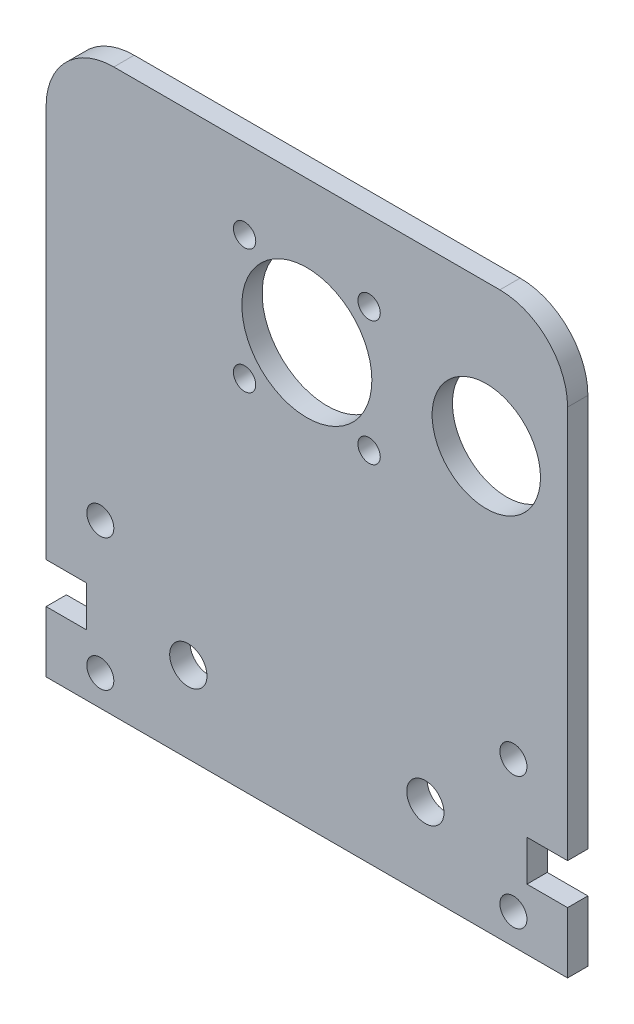
ISO-10303-21;
HEADER;
FILE_DESCRIPTION(('STEP AP214'),'2;1');
FILE_NAME('part.step','',(''),(''),'','','');
FILE_SCHEMA(('AUTOMOTIVE_DESIGN { 1 0 10303 214 1 1 1 1 }'));
ENDSEC;
DATA;
#1=APPLICATION_CONTEXT('core data for automotive mechanical design processes');
#2=APPLICATION_PROTOCOL_DEFINITION('international standard','automotive_design',2000,#1);
#3=PRODUCT_CONTEXT('',#1,'mechanical');
#4=PRODUCT('Part','Part','',(#3));
#5=PRODUCT_RELATED_PRODUCT_CATEGORY('part','',(#4));
#6=PRODUCT_DEFINITION_FORMATION('','',#4);
#7=PRODUCT_DEFINITION_CONTEXT('part definition',#1,'design');
#8=PRODUCT_DEFINITION('design','',#6,#7);
#9=PRODUCT_DEFINITION_SHAPE('','',#8);
#10=(LENGTH_UNIT() NAMED_UNIT(*) SI_UNIT(.MILLI.,.METRE.));
#11=(NAMED_UNIT(*) PLANE_ANGLE_UNIT() SI_UNIT($,.RADIAN.));
#12=(NAMED_UNIT(*) SI_UNIT($,.STERADIAN.) SOLID_ANGLE_UNIT());
#13=UNCERTAINTY_MEASURE_WITH_UNIT(LENGTH_MEASURE(1.E-05),#10,'distance_accuracy_value','');
#14=(GEOMETRIC_REPRESENTATION_CONTEXT(3) GLOBAL_UNCERTAINTY_ASSIGNED_CONTEXT((#13)) GLOBAL_UNIT_ASSIGNED_CONTEXT((#10,
#11,#12)) REPRESENTATION_CONTEXT('',''));
#15=CARTESIAN_POINT('',(0.,0.,0.));
#16=DIRECTION('',(0.,0.,1.));
#17=DIRECTION('',(1.,0.,0.));
#18=AXIS2_PLACEMENT_3D('',#15,#16,#17);
#19=CARTESIAN_POINT('',(77.,0.,3.));
#20=DIRECTION('',(-1.,0.,0.));
#21=DIRECTION('',(0.,0.,1.));
#22=AXIS2_PLACEMENT_3D('',#19,#20,#21);
#23=PLANE('',#22);
#24=DIRECTION('',(0.,1.,0.));
#25=VECTOR('',#24,1.);
#26=CARTESIAN_POINT('',(77.,0.,0.));
#27=LINE('',#26,#25);
#28=CARTESIAN_POINT('',(77.,-6.,0.));
#29=VERTEX_POINT('',#28);
#30=CARTESIAN_POINT('',(77.,3.00000000000001,0.));
#31=VERTEX_POINT('',#30);
#32=EDGE_CURVE('E196',#29,#31,#27,.T.);
#33=ORIENTED_EDGE('',*,*,#32,.T.);
#34=DIRECTION('',(0.,0.,-1.));
#35=VECTOR('',#34,1.);
#36=CARTESIAN_POINT('',(77.,3.00000000000001,3.));
#37=LINE('',#36,#35);
#38=CARTESIAN_POINT('',(77.,3.00000000000001,3.));
#39=VERTEX_POINT('',#38);
#40=EDGE_CURVE('E303',#39,#31,#37,.T.);
#41=ORIENTED_EDGE('',*,*,#40,.F.);
#42=DIRECTION('',(0.,1.,0.));
#43=VECTOR('',#42,1.);
#44=CARTESIAN_POINT('',(77.,0.,3.));
#45=LINE('',#44,#43);
#46=CARTESIAN_POINT('',(77.,-6.,3.));
#47=VERTEX_POINT('',#46);
#48=EDGE_CURVE('E181',#47,#39,#45,.T.);
#49=ORIENTED_EDGE('',*,*,#48,.F.);
#50=DIRECTION('',(0.,0.,1.));
#51=VECTOR('',#50,1.);
#52=CARTESIAN_POINT('',(77.,-6.,0.));
#53=LINE('',#52,#51);
#54=EDGE_CURVE('E191',#29,#47,#53,.T.);
#55=ORIENTED_EDGE('',*,*,#54,.F.);
#56=EDGE_LOOP('',(#33,#41,#49,#55));
#57=FACE_BOUND('',#56,.T.);
#58=ADVANCED_FACE('F65',(#57),#23,.F.);
#59=CARTESIAN_POINT('',(0.,2.99999999999999,3.));
#60=DIRECTION('',(0.,-1.,0.));
#61=DIRECTION('',(1.,0.,0.));
#62=AXIS2_PLACEMENT_3D('',#59,#60,#61);
#63=PLANE('',#62);
#64=DIRECTION('',(-1.,0.,0.));
#65=VECTOR('',#64,1.);
#66=CARTESIAN_POINT('',(0.,2.99999999999999,0.));
#67=LINE('',#66,#65);
#68=CARTESIAN_POINT('',(71.,3.00000000000001,0.));
#69=VERTEX_POINT('',#68);
#70=EDGE_CURVE('E266',#31,#69,#67,.T.);
#71=ORIENTED_EDGE('',*,*,#70,.T.);
#72=DIRECTION('',(0.,0.,-1.));
#73=VECTOR('',#72,1.);
#74=CARTESIAN_POINT('',(71.,3.00000000000001,3.));
#75=LINE('',#74,#73);
#76=CARTESIAN_POINT('',(71.,3.00000000000001,3.));
#77=VERTEX_POINT('',#76);
#78=EDGE_CURVE('E301',#77,#69,#75,.T.);
#79=ORIENTED_EDGE('',*,*,#78,.F.);
#80=DIRECTION('',(-1.,0.,0.));
#81=VECTOR('',#80,1.);
#82=CARTESIAN_POINT('',(0.,2.99999999999999,3.));
#83=LINE('',#82,#81);
#84=EDGE_CURVE('E217',#39,#77,#83,.T.);
#85=ORIENTED_EDGE('',*,*,#84,.F.);
#86=ORIENTED_EDGE('',*,*,#40,.T.);
#87=EDGE_LOOP('',(#71,#79,#85,#86));
#88=FACE_BOUND('',#87,.T.);
#89=ADVANCED_FACE('F354',(#88),#63,.F.);
#90=CARTESIAN_POINT('',(71.,0.,3.));
#91=DIRECTION('',(1.,0.,0.));
#92=DIRECTION('',(0.,0.,-1.));
#93=AXIS2_PLACEMENT_3D('',#90,#91,#92);
#94=PLANE('',#93);
#95=DIRECTION('',(0.,-1.,0.));
#96=VECTOR('',#95,1.);
#97=CARTESIAN_POINT('',(71.,0.,0.));
#98=LINE('',#97,#96);
#99=CARTESIAN_POINT('',(71.,9.00000000000001,0.));
#100=VERTEX_POINT('',#99);
#101=EDGE_CURVE('E270',#100,#69,#98,.T.);
#102=ORIENTED_EDGE('',*,*,#101,.F.);
#103=DIRECTION('',(0.,0.,-1.));
#104=VECTOR('',#103,1.);
#105=CARTESIAN_POINT('',(71.,9.00000000000001,3.));
#106=LINE('',#105,#104);
#107=CARTESIAN_POINT('',(71.,9.00000000000001,3.));
#108=VERTEX_POINT('',#107);
#109=EDGE_CURVE('E299',#108,#100,#106,.T.);
#110=ORIENTED_EDGE('',*,*,#109,.F.);
#111=DIRECTION('',(0.,-1.,0.));
#112=VECTOR('',#111,1.);
#113=CARTESIAN_POINT('',(71.,0.,3.));
#114=LINE('',#113,#112);
#115=EDGE_CURVE('E223',#108,#77,#114,.T.);
#116=ORIENTED_EDGE('',*,*,#115,.T.);
#117=ORIENTED_EDGE('',*,*,#78,.T.);
#118=EDGE_LOOP('',(#102,#110,#116,#117));
#119=FACE_BOUND('',#118,.T.);
#120=ADVANCED_FACE('F360',(#119),#94,.T.);
#121=CARTESIAN_POINT('',(0.,9.00000000000001,3.));
#122=DIRECTION('',(0.,-1.,0.));
#123=DIRECTION('',(0.,0.,-1.));
#124=AXIS2_PLACEMENT_3D('',#121,#122,#123);
#125=PLANE('',#124);
#126=DIRECTION('',(-1.,0.,0.));
#127=VECTOR('',#126,1.);
#128=CARTESIAN_POINT('',(0.,9.00000000000001,0.));
#129=LINE('',#128,#127);
#130=CARTESIAN_POINT('',(77.,9.00000000000001,0.));
#131=VERTEX_POINT('',#130);
#132=EDGE_CURVE('E273',#131,#100,#129,.T.);
#133=ORIENTED_EDGE('',*,*,#132,.F.);
#134=DIRECTION('',(0.,0.,-1.));
#135=VECTOR('',#134,1.);
#136=CARTESIAN_POINT('',(77.,9.00000000000001,3.));
#137=LINE('',#136,#135);
#138=CARTESIAN_POINT('',(77.,9.00000000000001,3.));
#139=VERTEX_POINT('',#138);
#140=EDGE_CURVE('E297',#139,#131,#137,.T.);
#141=ORIENTED_EDGE('',*,*,#140,.F.);
#142=DIRECTION('',(-1.,0.,0.));
#143=VECTOR('',#142,1.);
#144=CARTESIAN_POINT('',(0.,9.00000000000001,3.));
#145=LINE('',#144,#143);
#146=EDGE_CURVE('E226',#139,#108,#145,.T.);
#147=ORIENTED_EDGE('',*,*,#146,.T.);
#148=ORIENTED_EDGE('',*,*,#109,.T.);
#149=EDGE_LOOP('',(#133,#141,#147,#148));
#150=FACE_BOUND('',#149,.T.);
#151=ADVANCED_FACE('F499',(#150),#125,.T.);
#152=CARTESIAN_POINT('',(77.,0.,3.));
#153=DIRECTION('',(-1.,0.,0.));
#154=DIRECTION('',(0.,-1.,0.));
#155=AXIS2_PLACEMENT_3D('',#152,#153,#154);
#156=PLANE('',#155);
#157=DIRECTION('',(0.,1.,0.));
#158=VECTOR('',#157,1.);
#159=CARTESIAN_POINT('',(77.,0.,0.));
#160=LINE('',#159,#158);
#161=CARTESIAN_POINT('',(77.,67.,0.));
#162=VERTEX_POINT('',#161);
#163=EDGE_CURVE('E276',#131,#162,#160,.T.);
#164=ORIENTED_EDGE('',*,*,#163,.T.);
#165=DIRECTION('',(0.,0.,-1.));
#166=VECTOR('',#165,1.);
#167=CARTESIAN_POINT('',(77.,67.,3.));
#168=LINE('',#167,#166);
#169=CARTESIAN_POINT('',(77.,67.,3.));
#170=VERTEX_POINT('',#169);
#171=EDGE_CURVE('E88',#162,#170,#168,.F.);
#172=ORIENTED_EDGE('',*,*,#171,.T.);
#173=DIRECTION('',(0.,1.,0.));
#174=VECTOR('',#173,1.);
#175=CARTESIAN_POINT('',(77.,0.,3.));
#176=LINE('',#175,#174);
#177=EDGE_CURVE('E230',#139,#170,#176,.T.);
#178=ORIENTED_EDGE('',*,*,#177,.F.);
#179=ORIENTED_EDGE('',*,*,#140,.T.);
#180=EDGE_LOOP('',(#164,#172,#178,#179));
#181=FACE_BOUND('',#180,.T.);
#182=ADVANCED_FACE('F318',(#181),#156,.F.);
#183=CARTESIAN_POINT('',(0.,77.,3.));
#184=DIRECTION('',(0.,1.,0.));
#185=DIRECTION('',(-1.,0.,0.));
#186=AXIS2_PLACEMENT_3D('',#183,#184,#185);
#187=PLANE('',#186);
#188=DIRECTION('',(1.,0.,0.));
#189=VECTOR('',#188,1.);
#190=CARTESIAN_POINT('',(0.,77.,3.));
#191=LINE('',#190,#189);
#192=CARTESIAN_POINT('',(10.,77.,3.));
#193=VERTEX_POINT('',#192);
#194=CARTESIAN_POINT('',(67.,77.,3.));
#195=VERTEX_POINT('',#194);
#196=EDGE_CURVE('E233',#193,#195,#191,.T.);
#197=ORIENTED_EDGE('',*,*,#196,.T.);
#198=DIRECTION('',(0.,0.,-1.));
#199=VECTOR('',#198,1.);
#200=CARTESIAN_POINT('',(67.,77.,0.));
#201=LINE('',#200,#199);
#202=CARTESIAN_POINT('',(67.,77.,0.));
#203=VERTEX_POINT('',#202);
#204=EDGE_CURVE('E308',#195,#203,#201,.T.);
#205=ORIENTED_EDGE('',*,*,#204,.T.);
#206=DIRECTION('',(1.,0.,0.));
#207=VECTOR('',#206,1.);
#208=CARTESIAN_POINT('',(0.,77.,0.));
#209=LINE('',#208,#207);
#210=CARTESIAN_POINT('',(10.,77.,0.));
#211=VERTEX_POINT('',#210);
#212=EDGE_CURVE('E278',#211,#203,#209,.T.);
#213=ORIENTED_EDGE('',*,*,#212,.F.);
#214=DIRECTION('',(0.,0.,-1.));
#215=VECTOR('',#214,1.);
#216=CARTESIAN_POINT('',(10.,77.,3.));
#217=LINE('',#216,#215);
#218=EDGE_CURVE('E306',#211,#193,#217,.F.);
#219=ORIENTED_EDGE('',*,*,#218,.T.);
#220=EDGE_LOOP('',(#197,#205,#213,#219));
#221=FACE_BOUND('',#220,.T.);
#222=ADVANCED_FACE('F325',(#221),#187,.T.);
#223=CARTESIAN_POINT('',(0.,0.,3.));
#224=DIRECTION('',(-1.,0.,0.));
#225=DIRECTION('',(0.,0.,1.));
#226=AXIS2_PLACEMENT_3D('',#223,#224,#225);
#227=PLANE('',#226);
#228=DIRECTION('',(0.,1.,0.));
#229=VECTOR('',#228,1.);
#230=CARTESIAN_POINT('',(0.,0.,3.));
#231=LINE('',#230,#229);
#232=CARTESIAN_POINT('',(0.,9.,3.));
#233=VERTEX_POINT('',#232);
#234=CARTESIAN_POINT('',(0.,67.,3.));
#235=VERTEX_POINT('',#234);
#236=EDGE_CURVE('E251',#233,#235,#231,.T.);
#237=ORIENTED_EDGE('',*,*,#236,.T.);
#238=DIRECTION('',(0.,0.,-1.));
#239=VECTOR('',#238,1.);
#240=CARTESIAN_POINT('',(0.,67.,3.));
#241=LINE('',#240,#239);
#242=CARTESIAN_POINT('',(0.,67.,0.));
#243=VERTEX_POINT('',#242);
#244=EDGE_CURVE('E13',#235,#243,#241,.T.);
#245=ORIENTED_EDGE('',*,*,#244,.T.);
#246=DIRECTION('',(0.,1.,0.));
#247=VECTOR('',#246,1.);
#248=CARTESIAN_POINT('',(0.,0.,0.));
#249=LINE('',#248,#247);
#250=CARTESIAN_POINT('',(0.,9.,0.));
#251=VERTEX_POINT('',#250);
#252=EDGE_CURVE('E280',#251,#243,#249,.T.);
#253=ORIENTED_EDGE('',*,*,#252,.F.);
#254=DIRECTION('',(0.,0.,-1.));
#255=VECTOR('',#254,1.);
#256=CARTESIAN_POINT('',(0.,9.,3.));
#257=LINE('',#256,#255);
#258=EDGE_CURVE('E295',#233,#251,#257,.T.);
#259=ORIENTED_EDGE('',*,*,#258,.F.);
#260=EDGE_LOOP('',(#237,#245,#253,#259));
#261=FACE_BOUND('',#260,.T.);
#262=ADVANCED_FACE('F331',(#261),#227,.T.);
#263=CARTESIAN_POINT('',(0.,9.,3.));
#264=DIRECTION('',(0.,1.,0.));
#265=DIRECTION('',(0.,0.,1.));
#266=AXIS2_PLACEMENT_3D('',#263,#264,#265);
#267=PLANE('',#266);
#268=DIRECTION('',(1.,0.,0.));
#269=VECTOR('',#268,1.);
#270=CARTESIAN_POINT('',(0.,9.,0.));
#271=LINE('',#270,#269);
#272=CARTESIAN_POINT('',(6.,9.,0.));
#273=VERTEX_POINT('',#272);
#274=EDGE_CURVE('E283',#251,#273,#271,.T.);
#275=ORIENTED_EDGE('',*,*,#274,.T.);
#276=DIRECTION('',(0.,0.,-1.));
#277=VECTOR('',#276,1.);
#278=CARTESIAN_POINT('',(6.,9.,3.));
#279=LINE('',#278,#277);
#280=CARTESIAN_POINT('',(6.,9.,3.));
#281=VERTEX_POINT('',#280);
#282=EDGE_CURVE('E292',#281,#273,#279,.T.);
#283=ORIENTED_EDGE('',*,*,#282,.F.);
#284=DIRECTION('',(1.,0.,0.));
#285=VECTOR('',#284,1.);
#286=CARTESIAN_POINT('',(0.,9.,3.));
#287=LINE('',#286,#285);
#288=EDGE_CURVE('E253',#233,#281,#287,.T.);
#289=ORIENTED_EDGE('',*,*,#288,.F.);
#290=ORIENTED_EDGE('',*,*,#258,.T.);
#291=EDGE_LOOP('',(#275,#283,#289,#290));
#292=FACE_BOUND('',#291,.T.);
#293=ADVANCED_FACE('F336',(#292),#267,.F.);
#294=CARTESIAN_POINT('',(6.,0.,3.));
#295=DIRECTION('',(1.,0.,0.));
#296=DIRECTION('',(0.,1.,0.));
#297=AXIS2_PLACEMENT_3D('',#294,#295,#296);
#298=PLANE('',#297);
#299=DIRECTION('',(0.,-1.,0.));
#300=VECTOR('',#299,1.);
#301=CARTESIAN_POINT('',(6.,0.,0.));
#302=LINE('',#301,#300);
#303=CARTESIAN_POINT('',(6.,3.,0.));
#304=VERTEX_POINT('',#303);
#305=EDGE_CURVE('E285',#273,#304,#302,.T.);
#306=ORIENTED_EDGE('',*,*,#305,.T.);
#307=DIRECTION('',(0.,0.,-1.));
#308=VECTOR('',#307,1.);
#309=CARTESIAN_POINT('',(6.,3.,3.));
#310=LINE('',#309,#308);
#311=CARTESIAN_POINT('',(6.,3.,3.));
#312=VERTEX_POINT('',#311);
#313=EDGE_CURVE('E290',#312,#304,#310,.T.);
#314=ORIENTED_EDGE('',*,*,#313,.F.);
#315=DIRECTION('',(0.,-1.,0.));
#316=VECTOR('',#315,1.);
#317=CARTESIAN_POINT('',(6.,0.,3.));
#318=LINE('',#317,#316);
#319=EDGE_CURVE('E256',#281,#312,#318,.T.);
#320=ORIENTED_EDGE('',*,*,#319,.F.);
#321=ORIENTED_EDGE('',*,*,#282,.T.);
#322=EDGE_LOOP('',(#306,#314,#320,#321));
#323=FACE_BOUND('',#322,.T.);
#324=ADVANCED_FACE('F340',(#323),#298,.F.);
#325=CARTESIAN_POINT('',(0.,3.,3.));
#326=DIRECTION('',(0.,1.,0.));
#327=DIRECTION('',(0.,0.,1.));
#328=AXIS2_PLACEMENT_3D('',#325,#326,#327);
#329=PLANE('',#328);
#330=DIRECTION('',(1.,0.,0.));
#331=VECTOR('',#330,1.);
#332=CARTESIAN_POINT('',(0.,3.,0.));
#333=LINE('',#332,#331);
#334=CARTESIAN_POINT('',(0.,3.,0.));
#335=VERTEX_POINT('',#334);
#336=EDGE_CURVE('E182',#335,#304,#333,.T.);
#337=ORIENTED_EDGE('',*,*,#336,.F.);
#338=DIRECTION('',(0.,0.,-1.));
#339=VECTOR('',#338,1.);
#340=CARTESIAN_POINT('',(0.,3.,3.));
#341=LINE('',#340,#339);
#342=CARTESIAN_POINT('',(0.,3.,3.));
#343=VERTEX_POINT('',#342);
#344=EDGE_CURVE('E176',#343,#335,#341,.T.);
#345=ORIENTED_EDGE('',*,*,#344,.F.);
#346=DIRECTION('',(1.,0.,0.));
#347=VECTOR('',#346,1.);
#348=CARTESIAN_POINT('',(0.,3.,3.));
#349=LINE('',#348,#347);
#350=EDGE_CURVE('E259',#343,#312,#349,.T.);
#351=ORIENTED_EDGE('',*,*,#350,.T.);
#352=ORIENTED_EDGE('',*,*,#313,.T.);
#353=EDGE_LOOP('',(#337,#345,#351,#352));
#354=FACE_BOUND('',#353,.T.);
#355=ADVANCED_FACE('F344',(#354),#329,.T.);
#356=CARTESIAN_POINT('',(0.,0.,3.));
#357=DIRECTION('',(-1.,0.,0.));
#358=DIRECTION('',(0.,0.,1.));
#359=AXIS2_PLACEMENT_3D('',#356,#357,#358);
#360=PLANE('',#359);
#361=DIRECTION('',(0.,1.,0.));
#362=VECTOR('',#361,1.);
#363=CARTESIAN_POINT('',(0.,0.,0.));
#364=LINE('',#363,#362);
#365=CARTESIAN_POINT('',(0.,-6.,0.));
#366=VERTEX_POINT('',#365);
#367=EDGE_CURVE('E170',#366,#335,#364,.T.);
#368=ORIENTED_EDGE('',*,*,#367,.F.);
#369=DIRECTION('',(0.,0.,1.));
#370=VECTOR('',#369,1.);
#371=CARTESIAN_POINT('',(0.,-6.,0.));
#372=LINE('',#371,#370);
#373=CARTESIAN_POINT('',(0.,-6.,3.));
#374=VERTEX_POINT('',#373);
#375=EDGE_CURVE('E174',#366,#374,#372,.T.);
#376=ORIENTED_EDGE('',*,*,#375,.T.);
#377=DIRECTION('',(0.,1.,0.));
#378=VECTOR('',#377,1.);
#379=CARTESIAN_POINT('',(0.,0.,3.));
#380=LINE('',#379,#378);
#381=EDGE_CURVE('E262',#374,#343,#380,.T.);
#382=ORIENTED_EDGE('',*,*,#381,.T.);
#383=ORIENTED_EDGE('',*,*,#344,.T.);
#384=EDGE_LOOP('',(#368,#376,#382,#383));
#385=FACE_BOUND('',#384,.T.);
#386=ADVANCED_FACE('F172',(#385),#360,.T.);
#387=CARTESIAN_POINT('',(0.,0.,3.));
#388=DIRECTION('',(0.,0.,1.));
#389=DIRECTION('',(1.,0.,0.));
#390=AXIS2_PLACEMENT_3D('',#387,#388,#389);
#391=PLANE('',#390);
#392=CARTESIAN_POINT('',(65.,56.,3.));
#393=DIRECTION('',(0.,0.,1.));
#394=DIRECTION('',(1.,0.,0.));
#395=AXIS2_PLACEMENT_3D('',#392,#393,#394);
#396=CIRCLE('',#395,8.00000000000003);
#397=CARTESIAN_POINT('',(73.,56.,3.));
#398=VERTEX_POINT('',#397);
#399=EDGE_CURVE('E680',#398,#398,#396,.T.);
#400=ORIENTED_EDGE('',*,*,#399,.F.);
#401=EDGE_LOOP('',(#400));
#402=FACE_BOUND('',#401,.T.);
#403=CARTESIAN_POINT('',(69.,18.,3.));
#404=DIRECTION('',(0.,0.,1.));
#405=DIRECTION('',(1.,0.,0.));
#406=AXIS2_PLACEMENT_3D('',#403,#404,#405);
#407=CIRCLE('',#406,2.);
#408=CARTESIAN_POINT('',(71.,18.,3.));
#409=VERTEX_POINT('',#408);
#410=EDGE_CURVE('E682',#409,#409,#407,.T.);
#411=ORIENTED_EDGE('',*,*,#410,.F.);
#412=EDGE_LOOP('',(#411));
#413=FACE_BOUND('',#412,.T.);
#414=CARTESIAN_POINT('',(8.,18.,3.));
#415=DIRECTION('',(0.,0.,1.));
#416=DIRECTION('',(1.,0.,0.));
#417=AXIS2_PLACEMENT_3D('',#414,#415,#416);
#418=CIRCLE('',#417,2.);
#419=CARTESIAN_POINT('',(10.,18.,3.));
#420=VERTEX_POINT('',#419);
#421=EDGE_CURVE('E686',#420,#420,#418,.T.);
#422=ORIENTED_EDGE('',*,*,#421,.F.);
#423=EDGE_LOOP('',(#422));
#424=FACE_BOUND('',#423,.T.);
#425=CARTESIAN_POINT('',(69.,-1.49999999999999,3.));
#426=DIRECTION('',(0.,0.,1.));
#427=DIRECTION('',(1.,0.,0.));
#428=AXIS2_PLACEMENT_3D('',#425,#426,#427);
#429=CIRCLE('',#428,2.);
#430=CARTESIAN_POINT('',(71.,-1.49999999999999,3.));
#431=VERTEX_POINT('',#430);
#432=EDGE_CURVE('E698',#431,#431,#429,.T.);
#433=ORIENTED_EDGE('',*,*,#432,.F.);
#434=EDGE_LOOP('',(#433));
#435=FACE_BOUND('',#434,.T.);
#436=CARTESIAN_POINT('',(8.,-1.5,3.));
#437=DIRECTION('',(0.,0.,1.));
#438=DIRECTION('',(1.,0.,0.));
#439=AXIS2_PLACEMENT_3D('',#436,#437,#438);
#440=CIRCLE('',#439,2.);
#441=CARTESIAN_POINT('',(10.,-1.5,3.));
#442=VERTEX_POINT('',#441);
#443=EDGE_CURVE('E202',#442,#442,#440,.T.);
#444=ORIENTED_EDGE('',*,*,#443,.F.);
#445=EDGE_LOOP('',(#444));
#446=FACE_BOUND('',#445,.T.);
#447=CARTESIAN_POINT('',(38.5,56.,3.));
#448=DIRECTION('',(0.,0.,1.));
#449=DIRECTION('',(1.,0.,0.));
#450=AXIS2_PLACEMENT_3D('',#447,#448,#449);
#451=CIRCLE('',#450,9.6);
#452=CARTESIAN_POINT('',(48.1,56.,3.));
#453=VERTEX_POINT('',#452);
#454=EDGE_CURVE('E487',#453,#453,#451,.T.);
#455=ORIENTED_EDGE('',*,*,#454,.F.);
#456=EDGE_LOOP('',(#455));
#457=FACE_BOUND('',#456,.T.);
#458=CARTESIAN_POINT('',(29.3076118445749,65.1923881554251,3.));
#459=DIRECTION('',(0.,0.,1.));
#460=DIRECTION('',(1.,0.,0.));
#461=AXIS2_PLACEMENT_3D('',#458,#459,#460);
#462=CIRCLE('',#461,1.65);
#463=CARTESIAN_POINT('',(30.9576118445749,65.1923881554251,3.));
#464=VERTEX_POINT('',#463);
#465=EDGE_CURVE('E483',#464,#464,#462,.T.);
#466=ORIENTED_EDGE('',*,*,#465,.F.);
#467=EDGE_LOOP('',(#466));
#468=FACE_BOUND('',#467,.T.);
#469=CARTESIAN_POINT('',(47.6923881554251,65.1923881554251,3.));
#470=DIRECTION('',(0.,0.,1.));
#471=DIRECTION('',(1.,0.,0.));
#472=AXIS2_PLACEMENT_3D('',#469,#470,#471);
#473=CIRCLE('',#472,1.65);
#474=CARTESIAN_POINT('',(49.3423881554251,65.1923881554251,3.));
#475=VERTEX_POINT('',#474);
#476=EDGE_CURVE('E474',#475,#475,#473,.T.);
#477=ORIENTED_EDGE('',*,*,#476,.F.);
#478=EDGE_LOOP('',(#477));
#479=FACE_BOUND('',#478,.T.);
#480=CARTESIAN_POINT('',(47.6923881554251,46.8076118445749,3.));
#481=DIRECTION('',(0.,0.,1.));
#482=DIRECTION('',(1.,0.,0.));
#483=AXIS2_PLACEMENT_3D('',#480,#481,#482);
#484=CIRCLE('',#483,1.65);
#485=CARTESIAN_POINT('',(49.3423881554251,46.8076118445749,3.));
#486=VERTEX_POINT('',#485);
#487=EDGE_CURVE('E469',#486,#486,#484,.T.);
#488=ORIENTED_EDGE('',*,*,#487,.F.);
#489=EDGE_LOOP('',(#488));
#490=FACE_BOUND('',#489,.T.);
#491=CARTESIAN_POINT('',(29.3076118445749,46.8076118445749,3.));
#492=DIRECTION('',(0.,0.,1.));
#493=DIRECTION('',(1.,0.,0.));
#494=AXIS2_PLACEMENT_3D('',#491,#492,#493);
#495=CIRCLE('',#494,1.64999999999999);
#496=CARTESIAN_POINT('',(30.9576118445749,46.8076118445749,3.));
#497=VERTEX_POINT('',#496);
#498=EDGE_CURVE('E465',#497,#497,#495,.T.);
#499=ORIENTED_EDGE('',*,*,#498,.F.);
#500=EDGE_LOOP('',(#499));
#501=FACE_BOUND('',#500,.T.);
#502=CARTESIAN_POINT('',(56.,6.00000000000001,3.));
#503=DIRECTION('',(0.,0.,1.));
#504=DIRECTION('',(1.,0.,0.));
#505=AXIS2_PLACEMENT_3D('',#502,#503,#504);
#506=CIRCLE('',#505,2.75);
#507=CARTESIAN_POINT('',(58.75,6.00000000000001,3.));
#508=VERTEX_POINT('',#507);
#509=EDGE_CURVE('E456',#508,#508,#506,.T.);
#510=ORIENTED_EDGE('',*,*,#509,.F.);
#511=EDGE_LOOP('',(#510));
#512=FACE_BOUND('',#511,.T.);
#513=CARTESIAN_POINT('',(21.,6.00000000000001,3.));
#514=DIRECTION('',(0.,0.,1.));
#515=DIRECTION('',(1.,0.,0.));
#516=AXIS2_PLACEMENT_3D('',#513,#514,#515);
#517=CIRCLE('',#516,2.75);
#518=CARTESIAN_POINT('',(23.75,6.00000000000001,3.));
#519=VERTEX_POINT('',#518);
#520=EDGE_CURVE('E218',#519,#519,#517,.T.);
#521=ORIENTED_EDGE('',*,*,#520,.F.);
#522=EDGE_LOOP('',(#521));
#523=FACE_BOUND('',#522,.T.);
#524=ORIENTED_EDGE('',*,*,#177,.T.);
#525=CARTESIAN_POINT('',(67.,67.,3.));
#526=DIRECTION('',(0.,0.,1.));
#527=DIRECTION('',(1.,0.,0.));
#528=AXIS2_PLACEMENT_3D('',#525,#526,#527);
#529=CIRCLE('',#528,10.);
#530=EDGE_CURVE('E73',#170,#195,#529,.T.);
#531=ORIENTED_EDGE('',*,*,#530,.T.);
#532=ORIENTED_EDGE('',*,*,#196,.F.);
#533=CARTESIAN_POINT('',(10.,67.,3.));
#534=DIRECTION('',(0.,0.,1.));
#535=DIRECTION('',(1.,0.,0.));
#536=AXIS2_PLACEMENT_3D('',#533,#534,#535);
#537=CIRCLE('',#536,10.);
#538=EDGE_CURVE('E80',#193,#235,#537,.T.);
#539=ORIENTED_EDGE('',*,*,#538,.T.);
#540=ORIENTED_EDGE('',*,*,#236,.F.);
#541=ORIENTED_EDGE('',*,*,#288,.T.);
#542=ORIENTED_EDGE('',*,*,#319,.T.);
#543=ORIENTED_EDGE('',*,*,#350,.F.);
#544=ORIENTED_EDGE('',*,*,#381,.F.);
#545=DIRECTION('',(1.,0.,0.));
#546=VECTOR('',#545,1.);
#547=CARTESIAN_POINT('',(0.,-6.,3.));
#548=LINE('',#547,#546);
#549=EDGE_CURVE('E190',#374,#47,#548,.T.);
#550=ORIENTED_EDGE('',*,*,#549,.T.);
#551=ORIENTED_EDGE('',*,*,#48,.T.);
#552=ORIENTED_EDGE('',*,*,#84,.T.);
#553=ORIENTED_EDGE('',*,*,#115,.F.);
#554=ORIENTED_EDGE('',*,*,#146,.F.);
#555=EDGE_LOOP('',(#524,#531,#532,#539,#540,#541,#542,#543,#544,#550,#551,#552,#553,#554));
#556=FACE_BOUND('',#555,.T.);
#557=ADVANCED_FACE('F322',(#402,#413,#424,#435,#446,#457,#468,#479,#490,#501,#512,#523,#556),
#391,.T.);
#558=CARTESIAN_POINT('',(0.,0.,0.));
#559=DIRECTION('',(0.,0.,1.));
#560=DIRECTION('',(1.,0.,0.));
#561=AXIS2_PLACEMENT_3D('',#558,#559,#560);
#562=PLANE('',#561);
#563=CARTESIAN_POINT('',(65.,56.,0.));
#564=DIRECTION('',(0.,0.,1.));
#565=DIRECTION('',(1.,0.,0.));
#566=AXIS2_PLACEMENT_3D('',#563,#564,#565);
#567=CIRCLE('',#566,8.00000000000003);
#568=CARTESIAN_POINT('',(73.,56.,0.));
#569=VERTEX_POINT('',#568);
#570=EDGE_CURVE('E413',#569,#569,#567,.T.);
#571=ORIENTED_EDGE('',*,*,#570,.T.);
#572=EDGE_LOOP('',(#571));
#573=FACE_BOUND('',#572,.T.);
#574=CARTESIAN_POINT('',(69.,18.,0.));
#575=DIRECTION('',(0.,0.,1.));
#576=DIRECTION('',(1.,0.,0.));
#577=AXIS2_PLACEMENT_3D('',#574,#575,#576);
#578=CIRCLE('',#577,2.);
#579=CARTESIAN_POINT('',(71.,18.,0.));
#580=VERTEX_POINT('',#579);
#581=EDGE_CURVE('E417',#580,#580,#578,.T.);
#582=ORIENTED_EDGE('',*,*,#581,.T.);
#583=EDGE_LOOP('',(#582));
#584=FACE_BOUND('',#583,.T.);
#585=CARTESIAN_POINT('',(8.,18.,0.));
#586=DIRECTION('',(0.,0.,1.));
#587=DIRECTION('',(1.,0.,0.));
#588=AXIS2_PLACEMENT_3D('',#585,#586,#587);
#589=CIRCLE('',#588,2.);
#590=CARTESIAN_POINT('',(10.,18.,0.));
#591=VERTEX_POINT('',#590);
#592=EDGE_CURVE('E421',#591,#591,#589,.T.);
#593=ORIENTED_EDGE('',*,*,#592,.T.);
#594=EDGE_LOOP('',(#593));
#595=FACE_BOUND('',#594,.T.);
#596=CARTESIAN_POINT('',(69.,-1.49999999999999,0.));
#597=DIRECTION('',(0.,0.,1.));
#598=DIRECTION('',(1.,0.,0.));
#599=AXIS2_PLACEMENT_3D('',#596,#597,#598);
#600=CIRCLE('',#599,2.);
#601=CARTESIAN_POINT('',(71.,-1.49999999999999,0.));
#602=VERTEX_POINT('',#601);
#603=EDGE_CURVE('E425',#602,#602,#600,.T.);
#604=ORIENTED_EDGE('',*,*,#603,.T.);
#605=EDGE_LOOP('',(#604));
#606=FACE_BOUND('',#605,.T.);
#607=CARTESIAN_POINT('',(8.,-1.5,0.));
#608=DIRECTION('',(0.,0.,1.));
#609=DIRECTION('',(1.,0.,0.));
#610=AXIS2_PLACEMENT_3D('',#607,#608,#609);
#611=CIRCLE('',#610,2.);
#612=CARTESIAN_POINT('',(10.,-1.5,0.));
#613=VERTEX_POINT('',#612);
#614=EDGE_CURVE('E199',#613,#613,#611,.T.);
#615=ORIENTED_EDGE('',*,*,#614,.T.);
#616=EDGE_LOOP('',(#615));
#617=FACE_BOUND('',#616,.T.);
#618=CARTESIAN_POINT('',(38.5,56.,0.));
#619=DIRECTION('',(0.,0.,1.));
#620=DIRECTION('',(1.,0.,0.));
#621=AXIS2_PLACEMENT_3D('',#618,#619,#620);
#622=CIRCLE('',#621,9.6);
#623=CARTESIAN_POINT('',(48.1,56.,0.));
#624=VERTEX_POINT('',#623);
#625=EDGE_CURVE('E431',#624,#624,#622,.T.);
#626=ORIENTED_EDGE('',*,*,#625,.T.);
#627=EDGE_LOOP('',(#626));
#628=FACE_BOUND('',#627,.T.);
#629=CARTESIAN_POINT('',(29.3076118445749,65.1923881554251,0.));
#630=DIRECTION('',(0.,0.,1.));
#631=DIRECTION('',(1.,0.,0.));
#632=AXIS2_PLACEMENT_3D('',#629,#630,#631);
#633=CIRCLE('',#632,1.65);
#634=CARTESIAN_POINT('',(30.9576118445749,65.1923881554251,0.));
#635=VERTEX_POINT('',#634);
#636=EDGE_CURVE('E435',#635,#635,#633,.T.);
#637=ORIENTED_EDGE('',*,*,#636,.T.);
#638=EDGE_LOOP('',(#637));
#639=FACE_BOUND('',#638,.T.);
#640=CARTESIAN_POINT('',(47.6923881554251,65.1923881554251,0.));
#641=DIRECTION('',(0.,0.,1.));
#642=DIRECTION('',(1.,0.,0.));
#643=AXIS2_PLACEMENT_3D('',#640,#641,#642);
#644=CIRCLE('',#643,1.65);
#645=CARTESIAN_POINT('',(49.3423881554251,65.1923881554251,0.));
#646=VERTEX_POINT('',#645);
#647=EDGE_CURVE('E439',#646,#646,#644,.T.);
#648=ORIENTED_EDGE('',*,*,#647,.T.);
#649=EDGE_LOOP('',(#648));
#650=FACE_BOUND('',#649,.T.);
#651=CARTESIAN_POINT('',(47.6923881554251,46.8076118445749,0.));
#652=DIRECTION('',(0.,0.,1.));
#653=DIRECTION('',(1.,0.,0.));
#654=AXIS2_PLACEMENT_3D('',#651,#652,#653);
#655=CIRCLE('',#654,1.65);
#656=CARTESIAN_POINT('',(49.3423881554251,46.8076118445749,0.));
#657=VERTEX_POINT('',#656);
#658=EDGE_CURVE('E443',#657,#657,#655,.T.);
#659=ORIENTED_EDGE('',*,*,#658,.T.);
#660=EDGE_LOOP('',(#659));
#661=FACE_BOUND('',#660,.T.);
#662=CARTESIAN_POINT('',(29.3076118445749,46.8076118445749,0.));
#663=DIRECTION('',(0.,0.,1.));
#664=DIRECTION('',(1.,0.,0.));
#665=AXIS2_PLACEMENT_3D('',#662,#663,#664);
#666=CIRCLE('',#665,1.64999999999999);
#667=CARTESIAN_POINT('',(30.9576118445749,46.8076118445749,0.));
#668=VERTEX_POINT('',#667);
#669=EDGE_CURVE('E447',#668,#668,#666,.T.);
#670=ORIENTED_EDGE('',*,*,#669,.T.);
#671=EDGE_LOOP('',(#670));
#672=FACE_BOUND('',#671,.T.);
#673=CARTESIAN_POINT('',(56.,6.00000000000001,0.));
#674=DIRECTION('',(0.,0.,1.));
#675=DIRECTION('',(1.,0.,0.));
#676=AXIS2_PLACEMENT_3D('',#673,#674,#675);
#677=CIRCLE('',#676,2.75);
#678=CARTESIAN_POINT('',(58.75,6.00000000000001,0.));
#679=VERTEX_POINT('',#678);
#680=EDGE_CURVE('E451',#679,#679,#677,.T.);
#681=ORIENTED_EDGE('',*,*,#680,.T.);
#682=EDGE_LOOP('',(#681));
#683=FACE_BOUND('',#682,.T.);
#684=CARTESIAN_POINT('',(21.,6.00000000000001,0.));
#685=DIRECTION('',(0.,0.,1.));
#686=DIRECTION('',(1.,0.,0.));
#687=AXIS2_PLACEMENT_3D('',#684,#685,#686);
#688=CIRCLE('',#687,2.75);
#689=CARTESIAN_POINT('',(23.75,6.00000000000001,0.));
#690=VERTEX_POINT('',#689);
#691=EDGE_CURVE('E267',#690,#690,#688,.T.);
#692=ORIENTED_EDGE('',*,*,#691,.T.);
#693=EDGE_LOOP('',(#692));
#694=FACE_BOUND('',#693,.T.);
#695=ORIENTED_EDGE('',*,*,#212,.T.);
#696=CARTESIAN_POINT('',(67.,67.,0.));
#697=DIRECTION('',(0.,0.,1.));
#698=DIRECTION('',(1.,0.,0.));
#699=AXIS2_PLACEMENT_3D('',#696,#697,#698);
#700=CIRCLE('',#699,10.);
#701=EDGE_CURVE('E312',#203,#162,#700,.F.);
#702=ORIENTED_EDGE('',*,*,#701,.T.);
#703=ORIENTED_EDGE('',*,*,#163,.F.);
#704=ORIENTED_EDGE('',*,*,#132,.T.);
#705=ORIENTED_EDGE('',*,*,#101,.T.);
#706=ORIENTED_EDGE('',*,*,#70,.F.);
#707=ORIENTED_EDGE('',*,*,#32,.F.);
#708=DIRECTION('',(1.,0.,0.));
#709=VECTOR('',#708,1.);
#710=CARTESIAN_POINT('',(0.,-6.,0.));
#711=LINE('',#710,#709);
#712=EDGE_CURVE('E188',#366,#29,#711,.T.);
#713=ORIENTED_EDGE('',*,*,#712,.F.);
#714=ORIENTED_EDGE('',*,*,#367,.T.);
#715=ORIENTED_EDGE('',*,*,#336,.T.);
#716=ORIENTED_EDGE('',*,*,#305,.F.);
#717=ORIENTED_EDGE('',*,*,#274,.F.);
#718=ORIENTED_EDGE('',*,*,#252,.T.);
#719=CARTESIAN_POINT('',(10.,67.,0.));
#720=DIRECTION('',(0.,0.,1.));
#721=DIRECTION('',(1.,0.,0.));
#722=AXIS2_PLACEMENT_3D('',#719,#720,#721);
#723=CIRCLE('',#722,10.);
#724=EDGE_CURVE('E311',#243,#211,#723,.F.);
#725=ORIENTED_EDGE('',*,*,#724,.T.);
#726=EDGE_LOOP('',(#695,#702,#703,#704,#705,#706,#707,#713,#714,#715,#716,#717,#718,#725));
#727=FACE_BOUND('',#726,.T.);
#728=ADVANCED_FACE('F194',(#573,#584,#595,#606,#617,#628,#639,#650,#661,#672,#683,#694,#727),
#562,.F.);
#729=CARTESIAN_POINT('',(21.,6.00000000000001,0.));
#730=DIRECTION('',(0.,0.,1.));
#731=DIRECTION('',(1.,0.,0.));
#732=AXIS2_PLACEMENT_3D('',#729,#730,#731);
#733=CYLINDRICAL_SURFACE('',#732,2.75);
#734=ORIENTED_EDGE('',*,*,#691,.F.);
#735=EDGE_LOOP('',(#734));
#736=FACE_BOUND('',#735,.T.);
#737=ORIENTED_EDGE('',*,*,#520,.T.);
#738=EDGE_LOOP('',(#737));
#739=FACE_BOUND('',#738,.T.);
#740=ADVANCED_FACE('F398',(#736,#739),#733,.F.);
#741=CARTESIAN_POINT('',(56.,6.00000000000001,0.));
#742=DIRECTION('',(0.,0.,1.));
#743=DIRECTION('',(1.,0.,0.));
#744=AXIS2_PLACEMENT_3D('',#741,#742,#743);
#745=CYLINDRICAL_SURFACE('',#744,2.75);
#746=ORIENTED_EDGE('',*,*,#680,.F.);
#747=EDGE_LOOP('',(#746));
#748=FACE_BOUND('',#747,.T.);
#749=ORIENTED_EDGE('',*,*,#509,.T.);
#750=EDGE_LOOP('',(#749));
#751=FACE_BOUND('',#750,.T.);
#752=ADVANCED_FACE('F394',(#748,#751),#745,.F.);
#753=CARTESIAN_POINT('',(29.3076118445749,46.8076118445749,0.));
#754=DIRECTION('',(0.,0.,1.));
#755=DIRECTION('',(1.,0.,0.));
#756=AXIS2_PLACEMENT_3D('',#753,#754,#755);
#757=CYLINDRICAL_SURFACE('',#756,1.64999999999999);
#758=ORIENTED_EDGE('',*,*,#669,.F.);
#759=EDGE_LOOP('',(#758));
#760=FACE_BOUND('',#759,.T.);
#761=ORIENTED_EDGE('',*,*,#498,.T.);
#762=EDGE_LOOP('',(#761));
#763=FACE_BOUND('',#762,.T.);
#764=ADVANCED_FACE('F390',(#760,#763),#757,.F.);
#765=CARTESIAN_POINT('',(47.6923881554251,46.8076118445749,0.));
#766=DIRECTION('',(0.,0.,1.));
#767=DIRECTION('',(1.,0.,0.));
#768=AXIS2_PLACEMENT_3D('',#765,#766,#767);
#769=CYLINDRICAL_SURFACE('',#768,1.65);
#770=ORIENTED_EDGE('',*,*,#658,.F.);
#771=EDGE_LOOP('',(#770));
#772=FACE_BOUND('',#771,.T.);
#773=ORIENTED_EDGE('',*,*,#487,.T.);
#774=EDGE_LOOP('',(#773));
#775=FACE_BOUND('',#774,.T.);
#776=ADVANCED_FACE('F386',(#772,#775),#769,.F.);
#777=CARTESIAN_POINT('',(47.6923881554251,65.1923881554251,0.));
#778=DIRECTION('',(0.,0.,1.));
#779=DIRECTION('',(1.,0.,0.));
#780=AXIS2_PLACEMENT_3D('',#777,#778,#779);
#781=CYLINDRICAL_SURFACE('',#780,1.65);
#782=ORIENTED_EDGE('',*,*,#647,.F.);
#783=EDGE_LOOP('',(#782));
#784=FACE_BOUND('',#783,.T.);
#785=ORIENTED_EDGE('',*,*,#476,.T.);
#786=EDGE_LOOP('',(#785));
#787=FACE_BOUND('',#786,.T.);
#788=ADVANCED_FACE('F376',(#784,#787),#781,.F.);
#789=CARTESIAN_POINT('',(29.3076118445749,65.1923881554251,0.));
#790=DIRECTION('',(0.,0.,1.));
#791=DIRECTION('',(1.,0.,0.));
#792=AXIS2_PLACEMENT_3D('',#789,#790,#791);
#793=CYLINDRICAL_SURFACE('',#792,1.65);
#794=ORIENTED_EDGE('',*,*,#636,.F.);
#795=EDGE_LOOP('',(#794));
#796=FACE_BOUND('',#795,.T.);
#797=ORIENTED_EDGE('',*,*,#465,.T.);
#798=EDGE_LOOP('',(#797));
#799=FACE_BOUND('',#798,.T.);
#800=ADVANCED_FACE('F370',(#796,#799),#793,.F.);
#801=CARTESIAN_POINT('',(38.5,56.,0.));
#802=DIRECTION('',(0.,0.,1.));
#803=DIRECTION('',(1.,0.,0.));
#804=AXIS2_PLACEMENT_3D('',#801,#802,#803);
#805=CYLINDRICAL_SURFACE('',#804,9.6);
#806=ORIENTED_EDGE('',*,*,#625,.F.);
#807=EDGE_LOOP('',(#806));
#808=FACE_BOUND('',#807,.T.);
#809=ORIENTED_EDGE('',*,*,#454,.T.);
#810=EDGE_LOOP('',(#809));
#811=FACE_BOUND('',#810,.T.);
#812=ADVANCED_FACE('F365',(#808,#811),#805,.F.);
#813=CARTESIAN_POINT('',(67.,67.,3.));
#814=DIRECTION('',(0.,0.,1.));
#815=DIRECTION('',(1.,0.,0.));
#816=AXIS2_PLACEMENT_3D('',#813,#814,#815);
#817=CYLINDRICAL_SURFACE('',#816,10.);
#818=ORIENTED_EDGE('',*,*,#530,.F.);
#819=ORIENTED_EDGE('',*,*,#171,.F.);
#820=ORIENTED_EDGE('',*,*,#701,.F.);
#821=ORIENTED_EDGE('',*,*,#204,.F.);
#822=EDGE_LOOP('',(#818,#819,#820,#821));
#823=FACE_BOUND('',#822,.T.);
#824=ADVANCED_FACE('F320',(#823),#817,.T.);
#825=CARTESIAN_POINT('',(10.,67.,3.));
#826=DIRECTION('',(0.,0.,-1.));
#827=DIRECTION('',(-1.,0.,0.));
#828=AXIS2_PLACEMENT_3D('',#825,#826,#827);
#829=CYLINDRICAL_SURFACE('',#828,10.);
#830=ORIENTED_EDGE('',*,*,#538,.F.);
#831=ORIENTED_EDGE('',*,*,#218,.F.);
#832=ORIENTED_EDGE('',*,*,#724,.F.);
#833=ORIENTED_EDGE('',*,*,#244,.F.);
#834=EDGE_LOOP('',(#830,#831,#832,#833));
#835=FACE_BOUND('',#834,.T.);
#836=ADVANCED_FACE('F67',(#835),#829,.T.);
#837=CARTESIAN_POINT('',(0.,-6.,0.));
#838=DIRECTION('',(0.,-1.,0.));
#839=DIRECTION('',(0.,0.,-1.));
#840=AXIS2_PLACEMENT_3D('',#837,#838,#839);
#841=PLANE('',#840);
#842=ORIENTED_EDGE('',*,*,#549,.F.);
#843=ORIENTED_EDGE('',*,*,#375,.F.);
#844=ORIENTED_EDGE('',*,*,#712,.T.);
#845=ORIENTED_EDGE('',*,*,#54,.T.);
#846=EDGE_LOOP('',(#842,#843,#844,#845));
#847=FACE_BOUND('',#846,.T.);
#848=ADVANCED_FACE('F186',(#847),#841,.T.);
#849=CARTESIAN_POINT('',(8.,-1.5,0.));
#850=DIRECTION('',(0.,0.,1.));
#851=DIRECTION('',(1.,0.,0.));
#852=AXIS2_PLACEMENT_3D('',#849,#850,#851);
#853=CYLINDRICAL_SURFACE('',#852,2.);
#854=ORIENTED_EDGE('',*,*,#614,.F.);
#855=EDGE_LOOP('',(#854));
#856=FACE_BOUND('',#855,.T.);
#857=ORIENTED_EDGE('',*,*,#443,.T.);
#858=EDGE_LOOP('',(#857));
#859=FACE_BOUND('',#858,.T.);
#860=ADVANCED_FACE('F616',(#856,#859),#853,.F.);
#861=CARTESIAN_POINT('',(69.,-1.49999999999999,0.));
#862=DIRECTION('',(0.,0.,1.));
#863=DIRECTION('',(1.,0.,0.));
#864=AXIS2_PLACEMENT_3D('',#861,#862,#863);
#865=CYLINDRICAL_SURFACE('',#864,2.);
#866=ORIENTED_EDGE('',*,*,#603,.F.);
#867=EDGE_LOOP('',(#866));
#868=FACE_BOUND('',#867,.T.);
#869=ORIENTED_EDGE('',*,*,#432,.T.);
#870=EDGE_LOOP('',(#869));
#871=FACE_BOUND('',#870,.T.);
#872=ADVANCED_FACE('F625',(#868,#871),#865,.F.);
#873=CARTESIAN_POINT('',(8.,18.,0.));
#874=DIRECTION('',(0.,0.,1.));
#875=DIRECTION('',(1.,0.,0.));
#876=AXIS2_PLACEMENT_3D('',#873,#874,#875);
#877=CYLINDRICAL_SURFACE('',#876,2.);
#878=ORIENTED_EDGE('',*,*,#592,.F.);
#879=EDGE_LOOP('',(#878));
#880=FACE_BOUND('',#879,.T.);
#881=ORIENTED_EDGE('',*,*,#421,.T.);
#882=EDGE_LOOP('',(#881));
#883=FACE_BOUND('',#882,.T.);
#884=ADVANCED_FACE('F634',(#880,#883),#877,.F.);
#885=CARTESIAN_POINT('',(69.,18.,0.));
#886=DIRECTION('',(0.,0.,1.));
#887=DIRECTION('',(1.,0.,0.));
#888=AXIS2_PLACEMENT_3D('',#885,#886,#887);
#889=CYLINDRICAL_SURFACE('',#888,2.);
#890=ORIENTED_EDGE('',*,*,#581,.F.);
#891=EDGE_LOOP('',(#890));
#892=FACE_BOUND('',#891,.T.);
#893=ORIENTED_EDGE('',*,*,#410,.T.);
#894=EDGE_LOOP('',(#893));
#895=FACE_BOUND('',#894,.T.);
#896=ADVANCED_FACE('F644',(#892,#895),#889,.F.);
#897=CARTESIAN_POINT('',(65.,56.,0.));
#898=DIRECTION('',(0.,0.,1.));
#899=DIRECTION('',(1.,0.,0.));
#900=AXIS2_PLACEMENT_3D('',#897,#898,#899);
#901=CYLINDRICAL_SURFACE('',#900,8.00000000000003);
#902=ORIENTED_EDGE('',*,*,#570,.F.);
#903=EDGE_LOOP('',(#902));
#904=FACE_BOUND('',#903,.T.);
#905=ORIENTED_EDGE('',*,*,#399,.T.);
#906=EDGE_LOOP('',(#905));
#907=FACE_BOUND('',#906,.T.);
#908=ADVANCED_FACE('F654',(#904,#907),#901,.F.);
#909=CLOSED_SHELL('',(#58,#89,#120,#151,#182,#222,#262,#293,#324,#355,#386,#557,#728,#740,#752,
#764,#776,#788,#800,#812,#824,#836,#848,#860,#872,#884,#896,#908));
#910=MANIFOLD_SOLID_BREP('B2',#909);
#911=ADVANCED_BREP_SHAPE_REPRESENTATION('',(#18,#910),#14);
#912=SHAPE_DEFINITION_REPRESENTATION(#9,#911);
ENDSEC;
END-ISO-10303-21;
